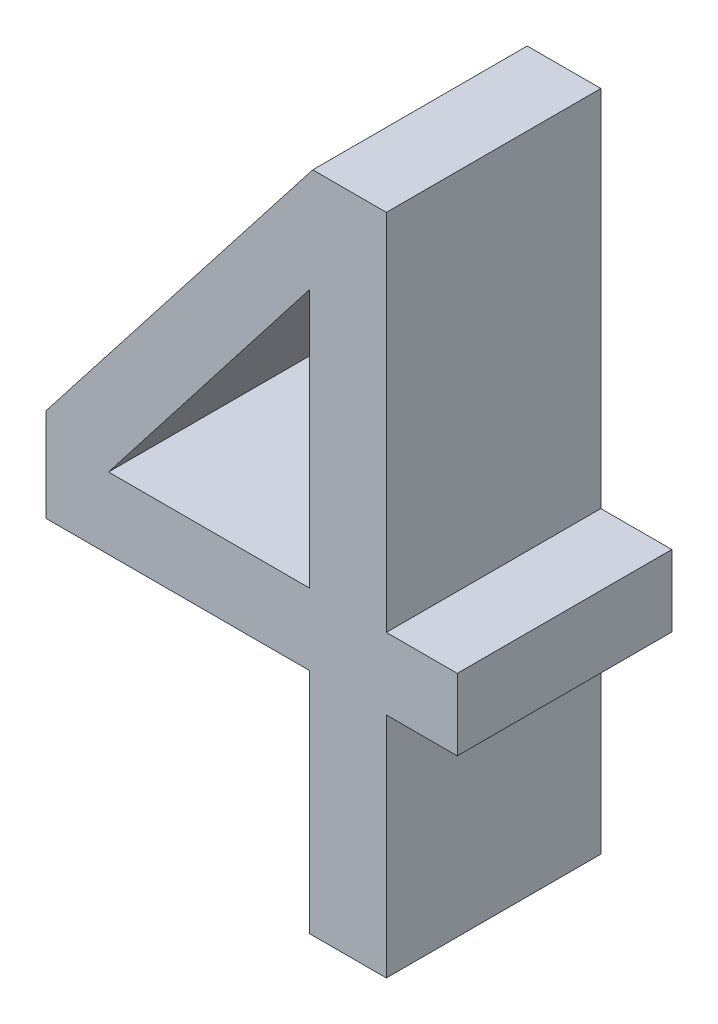
ISO-10303-21;
HEADER;
FILE_DESCRIPTION(('STEP AP214'),'2;1');
FILE_NAME('part.step','',(''),(''),'','','');
FILE_SCHEMA(('AUTOMOTIVE_DESIGN { 1 0 10303 214 1 1 1 1 }'));
ENDSEC;
DATA;
#1=APPLICATION_CONTEXT('core data for automotive mechanical design processes');
#2=APPLICATION_PROTOCOL_DEFINITION('international standard','automotive_design',2000,#1);
#3=PRODUCT_CONTEXT('',#1,'mechanical');
#4=PRODUCT('Part','Part','',(#3));
#5=PRODUCT_RELATED_PRODUCT_CATEGORY('part','',(#4));
#6=PRODUCT_DEFINITION_FORMATION('','',#4);
#7=PRODUCT_DEFINITION_CONTEXT('part definition',#1,'design');
#8=PRODUCT_DEFINITION('design','',#6,#7);
#9=PRODUCT_DEFINITION_SHAPE('','',#8);
#10=(LENGTH_UNIT() NAMED_UNIT(*) SI_UNIT(.MILLI.,.METRE.));
#11=(NAMED_UNIT(*) PLANE_ANGLE_UNIT() SI_UNIT($,.RADIAN.));
#12=(NAMED_UNIT(*) SI_UNIT($,.STERADIAN.) SOLID_ANGLE_UNIT());
#13=UNCERTAINTY_MEASURE_WITH_UNIT(LENGTH_MEASURE(1.E-05),#10,'distance_accuracy_value','');
#14=(GEOMETRIC_REPRESENTATION_CONTEXT(3) GLOBAL_UNCERTAINTY_ASSIGNED_CONTEXT((#13)) GLOBAL_UNIT_ASSIGNED_CONTEXT((#10,
#11,#12)) REPRESENTATION_CONTEXT('',''));
#15=CARTESIAN_POINT('',(0.,0.,0.));
#16=DIRECTION('',(0.,0.,1.));
#17=DIRECTION('',(1.,0.,0.));
#18=AXIS2_PLACEMENT_3D('',#15,#16,#17);
#19=CARTESIAN_POINT('',(-3.643753172758,0.32894960248165,0.));
#20=DIRECTION('',(0.,-1.,0.));
#21=DIRECTION('',(1.,0.,0.));
#22=AXIS2_PLACEMENT_3D('',#19,#20,#21);
#23=PLANE('',#22);
#24=DIRECTION('',(1.,0.,0.));
#25=VECTOR('',#24,1.);
#26=CARTESIAN_POINT('',(-3.601374753452,0.32894960248165,0.));
#27=LINE('',#26,#25);
#28=CARTESIAN_POINT('',(-3.643753172758,0.32894960248165,0.));
#29=VERTEX_POINT('',#28);
#30=CARTESIAN_POINT('',(-3.550070342205,0.32894960248165,0.));
#31=VERTEX_POINT('',#30);
#32=EDGE_CURVE('E11',#29,#31,#27,.T.);
#33=ORIENTED_EDGE('',*,*,#32,.F.);
#34=DIRECTION('',(0.,0.,1.));
#35=VECTOR('',#34,1.);
#36=CARTESIAN_POINT('',(-3.643753172758,0.32894960248165,0.));
#37=LINE('',#36,#35);
#38=CARTESIAN_POINT('',(-3.643753172758,0.32894960248165,0.1));
#39=VERTEX_POINT('',#38);
#40=EDGE_CURVE('E24',#29,#39,#37,.T.);
#41=ORIENTED_EDGE('',*,*,#40,.T.);
#42=DIRECTION('',(-1.,0.,0.));
#43=VECTOR('',#42,1.);
#44=CARTESIAN_POINT('',(-3.601374753452,0.32894960248165,0.1));
#45=LINE('',#44,#43);
#46=CARTESIAN_POINT('',(-3.550070342205,0.32894960248165,0.1));
#47=VERTEX_POINT('',#46);
#48=EDGE_CURVE('E228',#47,#39,#45,.T.);
#49=ORIENTED_EDGE('',*,*,#48,.F.);
#50=DIRECTION('',(0.,0.,1.));
#51=VECTOR('',#50,1.);
#52=CARTESIAN_POINT('',(-3.550070342205,0.32894960248165,0.));
#53=LINE('',#52,#51);
#54=EDGE_CURVE('E225',#31,#47,#53,.T.);
#55=ORIENTED_EDGE('',*,*,#54,.F.);
#56=EDGE_LOOP('',(#33,#41,#49,#55));
#57=FACE_BOUND('',#56,.T.);
#58=ADVANCED_FACE('F17',(#57),#23,.F.);
#59=CARTESIAN_POINT('',(-3.550070342205,0.449434740170851,0.));
#60=DIRECTION('',(-0.7894405841238,0.613826982250107,0.));
#61=DIRECTION('',(-0.613826982250107,-0.7894405841238,0.));
#62=AXIS2_PLACEMENT_3D('',#59,#60,#61);
#63=PLANE('',#62);
#64=DIRECTION('',(-0.613826982250107,-0.7894405841238,0.));
#65=VECTOR('',#64,1.);
#66=CARTESIAN_POINT('',(-3.578636020714,0.412696527971172,0.));
#67=LINE('',#66,#65);
#68=CARTESIAN_POINT('',(-3.550070342205,0.449434740170851,0.));
#69=VERTEX_POINT('',#68);
#70=EDGE_CURVE('E223',#69,#29,#67,.T.);
#71=ORIENTED_EDGE('',*,*,#70,.F.);
#72=DIRECTION('',(0.,0.,1.));
#73=VECTOR('',#72,1.);
#74=CARTESIAN_POINT('',(-3.550070342205,0.449434740170851,0.));
#75=LINE('',#74,#73);
#76=CARTESIAN_POINT('',(-3.550070342205,0.449434740170851,0.1));
#77=VERTEX_POINT('',#76);
#78=EDGE_CURVE('E221',#69,#77,#75,.T.);
#79=ORIENTED_EDGE('',*,*,#78,.T.);
#80=DIRECTION('',(0.613826982250107,0.7894405841238,0.));
#81=VECTOR('',#80,1.);
#82=CARTESIAN_POINT('',(-3.578636020714,0.412696527971172,0.1));
#83=LINE('',#82,#81);
#84=EDGE_CURVE('E218',#39,#77,#83,.T.);
#85=ORIENTED_EDGE('',*,*,#84,.F.);
#86=ORIENTED_EDGE('',*,*,#40,.F.);
#87=EDGE_LOOP('',(#71,#79,#85,#86));
#88=FACE_BOUND('',#87,.T.);
#89=ADVANCED_FACE('F233',(#88),#63,.F.);
#90=CARTESIAN_POINT('',(-3.550070342205,0.32894960248165,0.));
#91=DIRECTION('',(1.,0.,0.));
#92=DIRECTION('',(0.,1.,0.));
#93=AXIS2_PLACEMENT_3D('',#90,#91,#92);
#94=PLANE('',#93);
#95=DIRECTION('',(0.,1.,0.));
#96=VECTOR('',#95,1.);
#97=CARTESIAN_POINT('',(-3.550070342205,0.333712995988579,0.));
#98=LINE('',#97,#96);
#99=EDGE_CURVE('E216',#31,#69,#98,.T.);
#100=ORIENTED_EDGE('',*,*,#99,.F.);
#101=ORIENTED_EDGE('',*,*,#54,.T.);
#102=DIRECTION('',(0.,-1.,0.));
#103=VECTOR('',#102,1.);
#104=CARTESIAN_POINT('',(-3.550070342205,0.333712995988579,0.1));
#105=LINE('',#104,#103);
#106=EDGE_CURVE('E213',#77,#47,#105,.T.);
#107=ORIENTED_EDGE('',*,*,#106,.F.);
#108=ORIENTED_EDGE('',*,*,#78,.F.);
#109=EDGE_LOOP('',(#100,#101,#107,#108));
#110=FACE_BOUND('',#109,.T.);
#111=ADVANCED_FACE('F237',(#110),#94,.F.);
#112=CARTESIAN_POINT('',(-3.514250436406,0.189427312059852,0.));
#113=DIRECTION('',(1.,0.,0.));
#114=DIRECTION('',(0.,1.,0.));
#115=AXIS2_PLACEMENT_3D('',#112,#113,#114);
#116=PLANE('',#115);
#117=DIRECTION('',(0.,-1.,0.));
#118=VECTOR('',#117,1.);
#119=CARTESIAN_POINT('',(-3.514250436406,0.295634585199605,0.));
#120=LINE('',#119,#118);
#121=CARTESIAN_POINT('',(-3.514250436406,0.295634585199605,0.));
#122=VERTEX_POINT('',#121);
#123=CARTESIAN_POINT('',(-3.514250436406,0.189427312059852,0.));
#124=VERTEX_POINT('',#123);
#125=EDGE_CURVE('E211',#122,#124,#120,.T.);
#126=ORIENTED_EDGE('',*,*,#125,.F.);
#127=DIRECTION('',(0.,0.,1.));
#128=VECTOR('',#127,1.);
#129=CARTESIAN_POINT('',(-3.514250436406,0.295634585199605,0.));
#130=LINE('',#129,#128);
#131=CARTESIAN_POINT('',(-3.514250436406,0.295634585199605,0.1));
#132=VERTEX_POINT('',#131);
#133=EDGE_CURVE('E209',#122,#132,#130,.T.);
#134=ORIENTED_EDGE('',*,*,#133,.T.);
#135=DIRECTION('',(0.,1.,0.));
#136=VECTOR('',#135,1.);
#137=CARTESIAN_POINT('',(-3.514250436406,0.295634585199605,0.1));
#138=LINE('',#137,#136);
#139=CARTESIAN_POINT('',(-3.514250436406,0.189427312059852,0.1));
#140=VERTEX_POINT('',#139);
#141=EDGE_CURVE('E140',#140,#132,#138,.T.);
#142=ORIENTED_EDGE('',*,*,#141,.F.);
#143=DIRECTION('',(0.,0.,1.));
#144=VECTOR('',#143,1.);
#145=CARTESIAN_POINT('',(-3.514250436406,0.189427312059852,0.));
#146=LINE('',#145,#144);
#147=EDGE_CURVE('E205',#124,#140,#146,.T.);
#148=ORIENTED_EDGE('',*,*,#147,.F.);
#149=EDGE_LOOP('',(#126,#134,#142,#148));
#150=FACE_BOUND('',#149,.T.);
#151=ADVANCED_FACE('F256',(#150),#116,.T.);
#152=CARTESIAN_POINT('',(-3.550070342205,0.189427312059852,0.));
#153=DIRECTION('',(0.,-1.,0.));
#154=DIRECTION('',(1.,0.,0.));
#155=AXIS2_PLACEMENT_3D('',#152,#153,#154);
#156=PLANE('',#155);
#157=DIRECTION('',(-1.,0.,0.));
#158=VECTOR('',#157,1.);
#159=CARTESIAN_POINT('',(-3.514250436406,0.189427312059852,0.));
#160=LINE('',#159,#158);
#161=CARTESIAN_POINT('',(-3.550070342205,0.189427312059852,0.));
#162=VERTEX_POINT('',#161);
#163=EDGE_CURVE('E203',#124,#162,#160,.T.);
#164=ORIENTED_EDGE('',*,*,#163,.F.);
#165=ORIENTED_EDGE('',*,*,#147,.T.);
#166=DIRECTION('',(1.,0.,0.));
#167=VECTOR('',#166,1.);
#168=CARTESIAN_POINT('',(-3.514250436406,0.189427312059852,0.1));
#169=LINE('',#168,#167);
#170=CARTESIAN_POINT('',(-3.550070342205,0.189427312059852,0.1));
#171=VERTEX_POINT('',#170);
#172=EDGE_CURVE('E201',#171,#140,#169,.T.);
#173=ORIENTED_EDGE('',*,*,#172,.F.);
#174=DIRECTION('',(0.,0.,1.));
#175=VECTOR('',#174,1.);
#176=CARTESIAN_POINT('',(-3.550070342205,0.189427312059852,0.));
#177=LINE('',#176,#175);
#178=EDGE_CURVE('E198',#162,#171,#177,.T.);
#179=ORIENTED_EDGE('',*,*,#178,.F.);
#180=EDGE_LOOP('',(#164,#165,#173,#179));
#181=FACE_BOUND('',#180,.T.);
#182=ADVANCED_FACE('F261',(#181),#156,.T.);
#183=CARTESIAN_POINT('',(-3.550070342205,0.295634585199605,0.));
#184=DIRECTION('',(-1.,0.,0.));
#185=DIRECTION('',(0.,-1.,0.));
#186=AXIS2_PLACEMENT_3D('',#183,#184,#185);
#187=PLANE('',#186);
#188=DIRECTION('',(0.,1.,0.));
#189=VECTOR('',#188,1.);
#190=CARTESIAN_POINT('',(-3.550070342205,0.189427312059852,0.));
#191=LINE('',#190,#189);
#192=CARTESIAN_POINT('',(-3.550070342205,0.295634585199605,0.));
#193=VERTEX_POINT('',#192);
#194=EDGE_CURVE('E196',#162,#193,#191,.T.);
#195=ORIENTED_EDGE('',*,*,#194,.F.);
#196=ORIENTED_EDGE('',*,*,#178,.T.);
#197=DIRECTION('',(0.,-1.,0.));
#198=VECTOR('',#197,1.);
#199=CARTESIAN_POINT('',(-3.550070342205,0.189427312059852,0.1));
#200=LINE('',#199,#198);
#201=CARTESIAN_POINT('',(-3.550070342205,0.295634585199605,0.1));
#202=VERTEX_POINT('',#201);
#203=EDGE_CURVE('E193',#202,#171,#200,.T.);
#204=ORIENTED_EDGE('',*,*,#203,.F.);
#205=DIRECTION('',(0.,0.,1.));
#206=VECTOR('',#205,1.);
#207=CARTESIAN_POINT('',(-3.550070342205,0.295634585199605,0.));
#208=LINE('',#207,#206);
#209=EDGE_CURVE('E190',#193,#202,#208,.T.);
#210=ORIENTED_EDGE('',*,*,#209,.F.);
#211=EDGE_LOOP('',(#195,#196,#204,#210));
#212=FACE_BOUND('',#211,.T.);
#213=ADVANCED_FACE('F265',(#212),#187,.T.);
#214=CARTESIAN_POINT('',(-3.67280987956,0.295634585199605,0.));
#215=DIRECTION('',(0.,-1.,0.));
#216=DIRECTION('',(1.,0.,0.));
#217=AXIS2_PLACEMENT_3D('',#214,#215,#216);
#218=PLANE('',#217);
#219=DIRECTION('',(-1.,0.,0.));
#220=VECTOR('',#219,1.);
#221=CARTESIAN_POINT('',(-3.550070342205,0.295634585199605,0.));
#222=LINE('',#221,#220);
#223=CARTESIAN_POINT('',(-3.67280987956,0.295634585199605,0.));
#224=VERTEX_POINT('',#223);
#225=EDGE_CURVE('E188',#193,#224,#222,.T.);
#226=ORIENTED_EDGE('',*,*,#225,.F.);
#227=ORIENTED_EDGE('',*,*,#209,.T.);
#228=DIRECTION('',(1.,0.,0.));
#229=VECTOR('',#228,1.);
#230=CARTESIAN_POINT('',(-3.550070342205,0.295634585199605,0.1));
#231=LINE('',#230,#229);
#232=CARTESIAN_POINT('',(-3.67280987956,0.295634585199605,0.1));
#233=VERTEX_POINT('',#232);
#234=EDGE_CURVE('E185',#233,#202,#231,.T.);
#235=ORIENTED_EDGE('',*,*,#234,.F.);
#236=DIRECTION('',(0.,0.,1.));
#237=VECTOR('',#236,1.);
#238=CARTESIAN_POINT('',(-3.67280987956,0.295634585199605,0.));
#239=LINE('',#238,#237);
#240=EDGE_CURVE('E182',#224,#233,#239,.T.);
#241=ORIENTED_EDGE('',*,*,#240,.F.);
#242=EDGE_LOOP('',(#226,#227,#235,#241));
#243=FACE_BOUND('',#242,.T.);
#244=ADVANCED_FACE('F269',(#243),#218,.T.);
#245=CARTESIAN_POINT('',(-3.67280987956,0.339219645403183,0.));
#246=DIRECTION('',(-1.,0.,0.));
#247=DIRECTION('',(0.,-1.,0.));
#248=AXIS2_PLACEMENT_3D('',#245,#246,#247);
#249=PLANE('',#248);
#250=DIRECTION('',(0.,1.,0.));
#251=VECTOR('',#250,1.);
#252=CARTESIAN_POINT('',(-3.67280987956,0.295634585199605,0.));
#253=LINE('',#252,#251);
#254=CARTESIAN_POINT('',(-3.67280987956,0.339219645403183,0.));
#255=VERTEX_POINT('',#254);
#256=EDGE_CURVE('E180',#224,#255,#253,.T.);
#257=ORIENTED_EDGE('',*,*,#256,.F.);
#258=ORIENTED_EDGE('',*,*,#240,.T.);
#259=DIRECTION('',(0.,-1.,0.));
#260=VECTOR('',#259,1.);
#261=CARTESIAN_POINT('',(-3.67280987956,0.295634585199605,0.1));
#262=LINE('',#261,#260);
#263=CARTESIAN_POINT('',(-3.67280987956,0.339219645403183,0.1));
#264=VERTEX_POINT('',#263);
#265=EDGE_CURVE('E177',#264,#233,#262,.T.);
#266=ORIENTED_EDGE('',*,*,#265,.F.);
#267=DIRECTION('',(0.,0.,1.));
#268=VECTOR('',#267,1.);
#269=CARTESIAN_POINT('',(-3.67280987956,0.339219645403183,0.));
#270=LINE('',#269,#268);
#271=EDGE_CURVE('E174',#255,#264,#270,.T.);
#272=ORIENTED_EDGE('',*,*,#271,.F.);
#273=EDGE_LOOP('',(#257,#258,#266,#272));
#274=FACE_BOUND('',#273,.T.);
#275=ADVANCED_FACE('F273',(#274),#249,.T.);
#276=CARTESIAN_POINT('',(-3.548567409095,0.498530555112812,0.));
#277=DIRECTION('',(-0.788550405576857,0.614970127619687,0.));
#278=DIRECTION('',(-0.614970127619687,-0.788550405576857,0.));
#279=AXIS2_PLACEMENT_3D('',#276,#277,#278);
#280=PLANE('',#279);
#281=DIRECTION('',(0.614970127619687,0.788550405576857,0.));
#282=VECTOR('',#281,1.);
#283=CARTESIAN_POINT('',(-3.67280987956,0.339219645403183,0.));
#284=LINE('',#283,#282);
#285=CARTESIAN_POINT('',(-3.548567409095,0.498530555112812,0.));
#286=VERTEX_POINT('',#285);
#287=EDGE_CURVE('E172',#255,#286,#284,.T.);
#288=ORIENTED_EDGE('',*,*,#287,.F.);
#289=ORIENTED_EDGE('',*,*,#271,.T.);
#290=DIRECTION('',(-0.614970127619687,-0.788550405576857,0.));
#291=VECTOR('',#290,1.);
#292=CARTESIAN_POINT('',(-3.67280987956,0.339219645403183,0.1));
#293=LINE('',#292,#291);
#294=CARTESIAN_POINT('',(-3.548567409095,0.498530555112812,0.1));
#295=VERTEX_POINT('',#294);
#296=EDGE_CURVE('E169',#295,#264,#293,.T.);
#297=ORIENTED_EDGE('',*,*,#296,.F.);
#298=DIRECTION('',(0.,0.,1.));
#299=VECTOR('',#298,1.);
#300=CARTESIAN_POINT('',(-3.548567409095,0.498530555112812,0.));
#301=LINE('',#300,#299);
#302=EDGE_CURVE('E166',#286,#295,#301,.T.);
#303=ORIENTED_EDGE('',*,*,#302,.F.);
#304=EDGE_LOOP('',(#288,#289,#297,#303));
#305=FACE_BOUND('',#304,.T.);
#306=ADVANCED_FACE('F277',(#305),#280,.T.);
#307=CARTESIAN_POINT('',(-3.514250436406,0.498530555112812,0.));
#308=DIRECTION('',(0.,1.,0.));
#309=DIRECTION('',(-1.,0.,0.));
#310=AXIS2_PLACEMENT_3D('',#307,#308,#309);
#311=PLANE('',#310);
#312=DIRECTION('',(1.,0.,0.));
#313=VECTOR('',#312,1.);
#314=CARTESIAN_POINT('',(-3.548567409095,0.498530555112812,0.));
#315=LINE('',#314,#313);
#316=CARTESIAN_POINT('',(-3.514250436406,0.498530555112812,0.));
#317=VERTEX_POINT('',#316);
#318=EDGE_CURVE('E164',#286,#317,#315,.T.);
#319=ORIENTED_EDGE('',*,*,#318,.F.);
#320=ORIENTED_EDGE('',*,*,#302,.T.);
#321=DIRECTION('',(-1.,0.,0.));
#322=VECTOR('',#321,1.);
#323=CARTESIAN_POINT('',(-3.548567409095,0.498530555112812,0.1));
#324=LINE('',#323,#322);
#325=CARTESIAN_POINT('',(-3.514250436406,0.498530555112812,0.1));
#326=VERTEX_POINT('',#325);
#327=EDGE_CURVE('E161',#326,#295,#324,.T.);
#328=ORIENTED_EDGE('',*,*,#327,.F.);
#329=DIRECTION('',(0.,0.,1.));
#330=VECTOR('',#329,1.);
#331=CARTESIAN_POINT('',(-3.514250436406,0.498530555112812,0.));
#332=LINE('',#331,#330);
#333=EDGE_CURVE('E158',#317,#326,#332,.T.);
#334=ORIENTED_EDGE('',*,*,#333,.F.);
#335=EDGE_LOOP('',(#319,#320,#328,#334));
#336=FACE_BOUND('',#335,.T.);
#337=ADVANCED_FACE('F281',(#336),#311,.T.);
#338=CARTESIAN_POINT('',(-3.514250436406,0.32894960248165,0.));
#339=DIRECTION('',(1.,0.,0.));
#340=DIRECTION('',(0.,1.,0.));
#341=AXIS2_PLACEMENT_3D('',#338,#339,#340);
#342=PLANE('',#341);
#343=DIRECTION('',(0.,-1.,0.));
#344=VECTOR('',#343,1.);
#345=CARTESIAN_POINT('',(-3.514250436406,0.498530555112812,0.));
#346=LINE('',#345,#344);
#347=CARTESIAN_POINT('',(-3.514250436406,0.32894960248165,0.));
#348=VERTEX_POINT('',#347);
#349=EDGE_CURVE('E156',#317,#348,#346,.T.);
#350=ORIENTED_EDGE('',*,*,#349,.F.);
#351=ORIENTED_EDGE('',*,*,#333,.T.);
#352=DIRECTION('',(0.,1.,0.));
#353=VECTOR('',#352,1.);
#354=CARTESIAN_POINT('',(-3.514250436406,0.498530555112812,0.1));
#355=LINE('',#354,#353);
#356=CARTESIAN_POINT('',(-3.514250436406,0.32894960248165,0.1));
#357=VERTEX_POINT('',#356);
#358=EDGE_CURVE('E153',#357,#326,#355,.T.);
#359=ORIENTED_EDGE('',*,*,#358,.F.);
#360=DIRECTION('',(0.,0.,1.));
#361=VECTOR('',#360,1.);
#362=CARTESIAN_POINT('',(-3.514250436406,0.32894960248165,0.));
#363=LINE('',#362,#361);
#364=EDGE_CURVE('E150',#348,#357,#363,.T.);
#365=ORIENTED_EDGE('',*,*,#364,.F.);
#366=EDGE_LOOP('',(#350,#351,#359,#365));
#367=FACE_BOUND('',#366,.T.);
#368=ADVANCED_FACE('F285',(#367),#342,.T.);
#369=CARTESIAN_POINT('',(-3.481185907975,0.32894960248165,0.));
#370=DIRECTION('',(0.,1.,0.));
#371=DIRECTION('',(-1.,0.,0.));
#372=AXIS2_PLACEMENT_3D('',#369,#370,#371);
#373=PLANE('',#372);
#374=DIRECTION('',(1.,0.,0.));
#375=VECTOR('',#374,1.);
#376=CARTESIAN_POINT('',(-3.514250436406,0.32894960248165,0.));
#377=LINE('',#376,#375);
#378=CARTESIAN_POINT('',(-3.481185907975,0.32894960248165,0.));
#379=VERTEX_POINT('',#378);
#380=EDGE_CURVE('E148',#348,#379,#377,.T.);
#381=ORIENTED_EDGE('',*,*,#380,.F.);
#382=ORIENTED_EDGE('',*,*,#364,.T.);
#383=DIRECTION('',(-1.,0.,0.));
#384=VECTOR('',#383,1.);
#385=CARTESIAN_POINT('',(-3.514250436406,0.32894960248165,0.1));
#386=LINE('',#385,#384);
#387=CARTESIAN_POINT('',(-3.481185907975,0.32894960248165,0.1));
#388=VERTEX_POINT('',#387);
#389=EDGE_CURVE('E146',#388,#357,#386,.T.);
#390=ORIENTED_EDGE('',*,*,#389,.F.);
#391=DIRECTION('',(0.,0.,1.));
#392=VECTOR('',#391,1.);
#393=CARTESIAN_POINT('',(-3.481185907975,0.32894960248165,0.));
#394=LINE('',#393,#392);
#395=EDGE_CURVE('E122',#379,#388,#394,.T.);
#396=ORIENTED_EDGE('',*,*,#395,.F.);
#397=EDGE_LOOP('',(#381,#382,#390,#396));
#398=FACE_BOUND('',#397,.T.);
#399=ADVANCED_FACE('F289',(#398),#373,.T.);
#400=CARTESIAN_POINT('',(-3.481185907975,0.295634585199605,0.));
#401=DIRECTION('',(1.,0.,0.));
#402=DIRECTION('',(0.,1.,0.));
#403=AXIS2_PLACEMENT_3D('',#400,#401,#402);
#404=PLANE('',#403);
#405=DIRECTION('',(0.,-1.,0.));
#406=VECTOR('',#405,1.);
#407=CARTESIAN_POINT('',(-3.481185907975,0.32894960248165,0.));
#408=LINE('',#407,#406);
#409=CARTESIAN_POINT('',(-3.481185907975,0.295634585199605,0.));
#410=VERTEX_POINT('',#409);
#411=EDGE_CURVE('E126',#379,#410,#408,.T.);
#412=ORIENTED_EDGE('',*,*,#411,.F.);
#413=ORIENTED_EDGE('',*,*,#395,.T.);
#414=DIRECTION('',(0.,1.,0.));
#415=VECTOR('',#414,1.);
#416=CARTESIAN_POINT('',(-3.481185907975,0.32894960248165,0.1));
#417=LINE('',#416,#415);
#418=CARTESIAN_POINT('',(-3.481185907975,0.295634585199605,0.1));
#419=VERTEX_POINT('',#418);
#420=EDGE_CURVE('E115',#419,#388,#417,.T.);
#421=ORIENTED_EDGE('',*,*,#420,.F.);
#422=DIRECTION('',(0.,0.,1.));
#423=VECTOR('',#422,1.);
#424=CARTESIAN_POINT('',(-3.481185907975,0.295634585199605,0.));
#425=LINE('',#424,#423);
#426=EDGE_CURVE('E119',#410,#419,#425,.T.);
#427=ORIENTED_EDGE('',*,*,#426,.F.);
#428=EDGE_LOOP('',(#412,#413,#421,#427));
#429=FACE_BOUND('',#428,.T.);
#430=ADVANCED_FACE('F118',(#429),#404,.T.);
#431=CARTESIAN_POINT('',(-3.514250436406,0.295634585199605,0.));
#432=DIRECTION('',(0.,-1.,0.));
#433=DIRECTION('',(1.,0.,0.));
#434=AXIS2_PLACEMENT_3D('',#431,#432,#433);
#435=PLANE('',#434);
#436=DIRECTION('',(-1.,0.,0.));
#437=VECTOR('',#436,1.);
#438=CARTESIAN_POINT('',(-3.481185907975,0.295634585199605,0.));
#439=LINE('',#438,#437);
#440=EDGE_CURVE('E134',#410,#122,#439,.T.);
#441=ORIENTED_EDGE('',*,*,#440,.F.);
#442=ORIENTED_EDGE('',*,*,#426,.T.);
#443=DIRECTION('',(1.,0.,0.));
#444=VECTOR('',#443,1.);
#445=CARTESIAN_POINT('',(-3.481185907975,0.295634585199605,0.1));
#446=LINE('',#445,#444);
#447=EDGE_CURVE('E132',#132,#419,#446,.T.);
#448=ORIENTED_EDGE('',*,*,#447,.F.);
#449=ORIENTED_EDGE('',*,*,#133,.F.);
#450=EDGE_LOOP('',(#441,#442,#448,#449));
#451=FACE_BOUND('',#450,.T.);
#452=ADVANCED_FACE('F130',(#451),#435,.T.);
#453=CARTESIAN_POINT('',(-3.558996334146,0.338476389495508,0.));
#454=DIRECTION('',(0.,0.,1.));
#455=DIRECTION('',(1.,0.,0.));
#456=AXIS2_PLACEMENT_3D('',#453,#454,#455);
#457=PLANE('',#456);
#458=ORIENTED_EDGE('',*,*,#440,.T.);
#459=ORIENTED_EDGE('',*,*,#125,.T.);
#460=ORIENTED_EDGE('',*,*,#163,.T.);
#461=ORIENTED_EDGE('',*,*,#194,.T.);
#462=ORIENTED_EDGE('',*,*,#225,.T.);
#463=ORIENTED_EDGE('',*,*,#256,.T.);
#464=ORIENTED_EDGE('',*,*,#287,.T.);
#465=ORIENTED_EDGE('',*,*,#318,.T.);
#466=ORIENTED_EDGE('',*,*,#349,.T.);
#467=ORIENTED_EDGE('',*,*,#380,.T.);
#468=ORIENTED_EDGE('',*,*,#411,.T.);
#469=EDGE_LOOP('',(#458,#459,#460,#461,#462,#463,#464,#465,#466,#467,#468));
#470=FACE_BOUND('',#469,.T.);
#471=ORIENTED_EDGE('',*,*,#32,.T.);
#472=ORIENTED_EDGE('',*,*,#99,.T.);
#473=ORIENTED_EDGE('',*,*,#70,.T.);
#474=EDGE_LOOP('',(#471,#472,#473));
#475=FACE_BOUND('',#474,.T.);
#476=ADVANCED_FACE('F238',(#470,#475),#457,.F.);
#477=CARTESIAN_POINT('',(-3.558996334146,0.338476389495508,0.1));
#478=DIRECTION('',(0.,0.,1.));
#479=DIRECTION('',(1.,0.,0.));
#480=AXIS2_PLACEMENT_3D('',#477,#478,#479);
#481=PLANE('',#480);
#482=ORIENTED_EDGE('',*,*,#447,.T.);
#483=ORIENTED_EDGE('',*,*,#420,.T.);
#484=ORIENTED_EDGE('',*,*,#389,.T.);
#485=ORIENTED_EDGE('',*,*,#358,.T.);
#486=ORIENTED_EDGE('',*,*,#327,.T.);
#487=ORIENTED_EDGE('',*,*,#296,.T.);
#488=ORIENTED_EDGE('',*,*,#265,.T.);
#489=ORIENTED_EDGE('',*,*,#234,.T.);
#490=ORIENTED_EDGE('',*,*,#203,.T.);
#491=ORIENTED_EDGE('',*,*,#172,.T.);
#492=ORIENTED_EDGE('',*,*,#141,.T.);
#493=EDGE_LOOP('',(#482,#483,#484,#485,#486,#487,#488,#489,#490,#491,#492));
#494=FACE_BOUND('',#493,.T.);
#495=ORIENTED_EDGE('',*,*,#48,.T.);
#496=ORIENTED_EDGE('',*,*,#84,.T.);
#497=ORIENTED_EDGE('',*,*,#106,.T.);
#498=EDGE_LOOP('',(#495,#496,#497));
#499=FACE_BOUND('',#498,.T.);
#500=ADVANCED_FACE('F137',(#494,#499),#481,.T.);
#501=CLOSED_SHELL('',(#58,#89,#111,#151,#182,#213,#244,#275,#306,#337,#368,#399,#430,#452,#476,#500));
#502=MANIFOLD_SOLID_BREP('B1',#501);
#503=ADVANCED_BREP_SHAPE_REPRESENTATION('',(#18,#502),#14);
#504=SHAPE_DEFINITION_REPRESENTATION(#9,#503);
ENDSEC;
END-ISO-10303-21;
